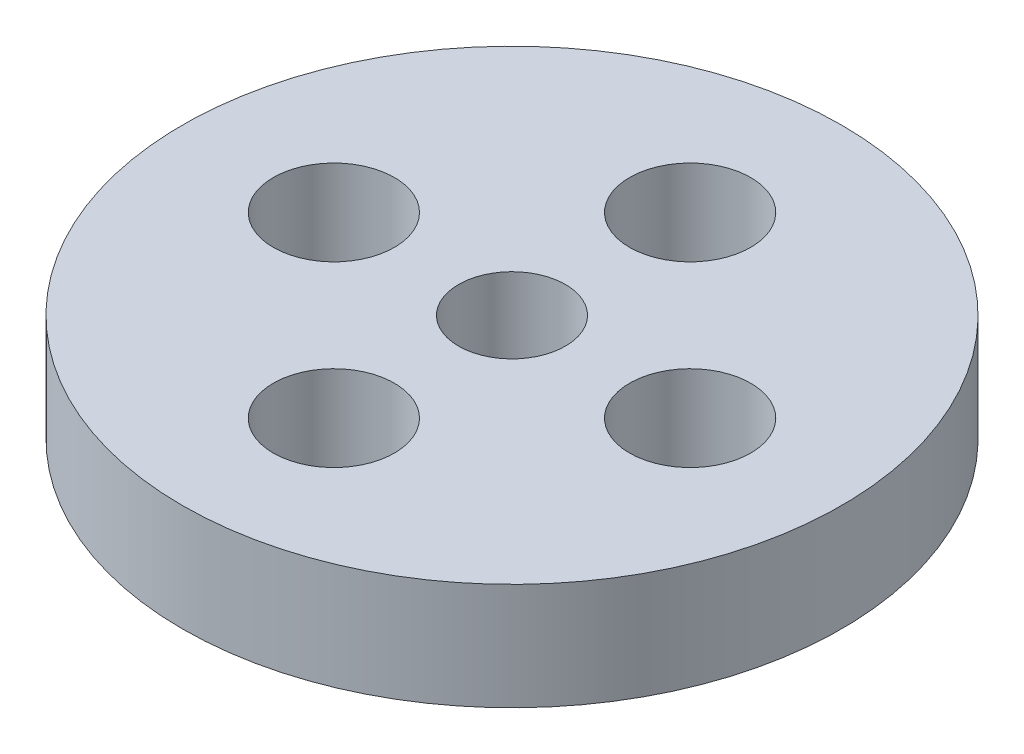
ISO-10303-21;
HEADER;
FILE_DESCRIPTION(('STEP AP214'),'2;1');
FILE_NAME('part.step','',(''),(''),'','','');
FILE_SCHEMA(('AUTOMOTIVE_DESIGN { 1 0 10303 214 1 1 1 1 }'));
ENDSEC;
DATA;
#1=APPLICATION_CONTEXT('core data for automotive mechanical design processes');
#2=APPLICATION_PROTOCOL_DEFINITION('international standard','automotive_design',2000,#1);
#3=PRODUCT_CONTEXT('',#1,'mechanical');
#4=PRODUCT('Part','Part','',(#3));
#5=PRODUCT_RELATED_PRODUCT_CATEGORY('part','',(#4));
#6=PRODUCT_DEFINITION_FORMATION('','',#4);
#7=PRODUCT_DEFINITION_CONTEXT('part definition',#1,'design');
#8=PRODUCT_DEFINITION('design','',#6,#7);
#9=PRODUCT_DEFINITION_SHAPE('','',#8);
#10=(LENGTH_UNIT() NAMED_UNIT(*) SI_UNIT(.MILLI.,.METRE.));
#11=(NAMED_UNIT(*) PLANE_ANGLE_UNIT() SI_UNIT($,.RADIAN.));
#12=(NAMED_UNIT(*) SI_UNIT($,.STERADIAN.) SOLID_ANGLE_UNIT());
#13=UNCERTAINTY_MEASURE_WITH_UNIT(LENGTH_MEASURE(1.E-05),#10,'distance_accuracy_value','');
#14=(GEOMETRIC_REPRESENTATION_CONTEXT(3) GLOBAL_UNCERTAINTY_ASSIGNED_CONTEXT((#13)) GLOBAL_UNIT_ASSIGNED_CONTEXT((#10,
#11,#12)) REPRESENTATION_CONTEXT('',''));
#15=CARTESIAN_POINT('',(0.,0.,0.));
#16=DIRECTION('',(0.,0.,1.));
#17=DIRECTION('',(1.,0.,0.));
#18=AXIS2_PLACEMENT_3D('',#15,#16,#17);
#19=CARTESIAN_POINT('',(0.,3.,0.));
#20=DIRECTION('',(0.,1.,0.));
#21=DIRECTION('',(0.,0.,1.));
#22=AXIS2_PLACEMENT_3D('',#19,#20,#21);
#23=PLANE('',#22);
#24=CARTESIAN_POINT('',(5.,3.,0.));
#25=DIRECTION('',(0.,1.,0.));
#26=DIRECTION('',(0.,0.,1.));
#27=AXIS2_PLACEMENT_3D('',#24,#25,#26);
#28=CIRCLE('',#27,1.7);
#29=CARTESIAN_POINT('',(5.,3.,1.7));
#30=VERTEX_POINT('',#29);
#31=EDGE_CURVE('E78',#30,#30,#28,.T.);
#32=ORIENTED_EDGE('',*,*,#31,.F.);
#33=EDGE_LOOP('',(#32));
#34=FACE_BOUND('',#33,.T.);
#35=CARTESIAN_POINT('',(0.,3.,0.));
#36=DIRECTION('',(0.,1.,0.));
#37=DIRECTION('',(0.,0.,1.));
#38=AXIS2_PLACEMENT_3D('',#35,#36,#37);
#39=CIRCLE('',#38,1.5);
#40=CARTESIAN_POINT('',(0.,3.,1.5));
#41=VERTEX_POINT('',#40);
#42=EDGE_CURVE('E62',#41,#41,#39,.T.);
#43=ORIENTED_EDGE('',*,*,#42,.F.);
#44=EDGE_LOOP('',(#43));
#45=FACE_BOUND('',#44,.T.);
#46=CARTESIAN_POINT('',(0.,3.,0.));
#47=DIRECTION('',(0.,1.,0.));
#48=DIRECTION('',(0.,0.,1.));
#49=AXIS2_PLACEMENT_3D('',#46,#47,#48);
#50=CIRCLE('',#49,9.25);
#51=CARTESIAN_POINT('',(0.,3.,9.25));
#52=VERTEX_POINT('',#51);
#53=EDGE_CURVE('E10',#52,#52,#50,.T.);
#54=ORIENTED_EDGE('',*,*,#53,.T.);
#55=EDGE_LOOP('',(#54));
#56=FACE_BOUND('',#55,.T.);
#57=CARTESIAN_POINT('',(-5.,3.,0.));
#58=DIRECTION('',(0.,1.,0.));
#59=DIRECTION('',(0.,0.,1.));
#60=AXIS2_PLACEMENT_3D('',#57,#58,#59);
#61=CIRCLE('',#60,1.7);
#62=CARTESIAN_POINT('',(-5.,3.,1.7));
#63=VERTEX_POINT('',#62);
#64=EDGE_CURVE('E56',#63,#63,#61,.T.);
#65=ORIENTED_EDGE('',*,*,#64,.F.);
#66=EDGE_LOOP('',(#65));
#67=FACE_BOUND('',#66,.T.);
#68=CARTESIAN_POINT('',(0.,3.,-5.));
#69=DIRECTION('',(0.,1.,0.));
#70=DIRECTION('',(0.,0.,1.));
#71=AXIS2_PLACEMENT_3D('',#68,#69,#70);
#72=CIRCLE('',#71,1.7);
#73=CARTESIAN_POINT('',(0.,3.,-3.3));
#74=VERTEX_POINT('',#73);
#75=EDGE_CURVE('E70',#74,#74,#72,.T.);
#76=ORIENTED_EDGE('',*,*,#75,.F.);
#77=EDGE_LOOP('',(#76));
#78=FACE_BOUND('',#77,.T.);
#79=CARTESIAN_POINT('',(0.,3.,5.));
#80=DIRECTION('',(0.,1.,0.));
#81=DIRECTION('',(0.,0.,1.));
#82=AXIS2_PLACEMENT_3D('',#79,#80,#81);
#83=CIRCLE('',#82,1.7);
#84=CARTESIAN_POINT('',(0.,3.,6.7));
#85=VERTEX_POINT('',#84);
#86=EDGE_CURVE('E86',#85,#85,#83,.T.);
#87=ORIENTED_EDGE('',*,*,#86,.F.);
#88=EDGE_LOOP('',(#87));
#89=FACE_BOUND('',#88,.T.);
#90=ADVANCED_FACE('F43',(#34,#45,#56,#67,#78,#89),#23,.T.);
#91=CARTESIAN_POINT('',(0.,0.,0.));
#92=DIRECTION('',(0.,1.,0.));
#93=DIRECTION('',(0.,0.,1.));
#94=AXIS2_PLACEMENT_3D('',#91,#92,#93);
#95=PLANE('',#94);
#96=CARTESIAN_POINT('',(0.,0.,0.));
#97=DIRECTION('',(0.,1.,0.));
#98=DIRECTION('',(0.,0.,1.));
#99=AXIS2_PLACEMENT_3D('',#96,#97,#98);
#100=CIRCLE('',#99,9.25);
#101=CARTESIAN_POINT('',(0.,0.,9.25));
#102=VERTEX_POINT('',#101);
#103=EDGE_CURVE('E47',#102,#102,#100,.T.);
#104=ORIENTED_EDGE('',*,*,#103,.F.);
#105=EDGE_LOOP('',(#104));
#106=FACE_BOUND('',#105,.T.);
#107=CARTESIAN_POINT('',(-5.,0.,0.));
#108=DIRECTION('',(0.,1.,0.));
#109=DIRECTION('',(0.,0.,1.));
#110=AXIS2_PLACEMENT_3D('',#107,#108,#109);
#111=CIRCLE('',#110,1.7);
#112=CARTESIAN_POINT('',(-5.,0.,1.7));
#113=VERTEX_POINT('',#112);
#114=EDGE_CURVE('E58',#113,#113,#111,.T.);
#115=ORIENTED_EDGE('',*,*,#114,.T.);
#116=EDGE_LOOP('',(#115));
#117=FACE_BOUND('',#116,.T.);
#118=CARTESIAN_POINT('',(0.,0.,0.));
#119=DIRECTION('',(0.,1.,0.));
#120=DIRECTION('',(0.,0.,1.));
#121=AXIS2_PLACEMENT_3D('',#118,#119,#120);
#122=CIRCLE('',#121,1.5);
#123=CARTESIAN_POINT('',(0.,0.,1.5));
#124=VERTEX_POINT('',#123);
#125=EDGE_CURVE('E66',#124,#124,#122,.T.);
#126=ORIENTED_EDGE('',*,*,#125,.T.);
#127=EDGE_LOOP('',(#126));
#128=FACE_BOUND('',#127,.T.);
#129=CARTESIAN_POINT('',(0.,0.,-5.));
#130=DIRECTION('',(0.,1.,0.));
#131=DIRECTION('',(0.,0.,1.));
#132=AXIS2_PLACEMENT_3D('',#129,#130,#131);
#133=CIRCLE('',#132,1.7);
#134=CARTESIAN_POINT('',(0.,0.,-3.3));
#135=VERTEX_POINT('',#134);
#136=EDGE_CURVE('E74',#135,#135,#133,.T.);
#137=ORIENTED_EDGE('',*,*,#136,.T.);
#138=EDGE_LOOP('',(#137));
#139=FACE_BOUND('',#138,.T.);
#140=CARTESIAN_POINT('',(5.,0.,0.));
#141=DIRECTION('',(0.,1.,0.));
#142=DIRECTION('',(0.,0.,1.));
#143=AXIS2_PLACEMENT_3D('',#140,#141,#142);
#144=CIRCLE('',#143,1.7);
#145=CARTESIAN_POINT('',(5.,0.,1.7));
#146=VERTEX_POINT('',#145);
#147=EDGE_CURVE('E82',#146,#146,#144,.T.);
#148=ORIENTED_EDGE('',*,*,#147,.T.);
#149=EDGE_LOOP('',(#148));
#150=FACE_BOUND('',#149,.T.);
#151=CARTESIAN_POINT('',(0.,0.,5.));
#152=DIRECTION('',(0.,1.,0.));
#153=DIRECTION('',(0.,0.,1.));
#154=AXIS2_PLACEMENT_3D('',#151,#152,#153);
#155=CIRCLE('',#154,1.7);
#156=CARTESIAN_POINT('',(0.,0.,6.7));
#157=VERTEX_POINT('',#156);
#158=EDGE_CURVE('E90',#157,#157,#155,.T.);
#159=ORIENTED_EDGE('',*,*,#158,.T.);
#160=EDGE_LOOP('',(#159));
#161=FACE_BOUND('',#160,.T.);
#162=ADVANCED_FACE('F102',(#106,#117,#128,#139,#150,#161),#95,.F.);
#163=CARTESIAN_POINT('',(0.,3.,0.));
#164=DIRECTION('',(0.,-1.,0.));
#165=DIRECTION('',(0.,0.,-1.));
#166=AXIS2_PLACEMENT_3D('',#163,#164,#165);
#167=CYLINDRICAL_SURFACE('',#166,9.25);
#168=ORIENTED_EDGE('',*,*,#53,.F.);
#169=EDGE_LOOP('',(#168));
#170=FACE_BOUND('',#169,.T.);
#171=ORIENTED_EDGE('',*,*,#103,.T.);
#172=EDGE_LOOP('',(#171));
#173=FACE_BOUND('',#172,.T.);
#174=ADVANCED_FACE('F45',(#170,#173),#167,.T.);
#175=CARTESIAN_POINT('',(-5.,3.,0.));
#176=DIRECTION('',(0.,-1.,0.));
#177=DIRECTION('',(0.,0.,-1.));
#178=AXIS2_PLACEMENT_3D('',#175,#176,#177);
#179=CYLINDRICAL_SURFACE('',#178,1.7);
#180=ORIENTED_EDGE('',*,*,#64,.T.);
#181=EDGE_LOOP('',(#180));
#182=FACE_BOUND('',#181,.T.);
#183=ORIENTED_EDGE('',*,*,#114,.F.);
#184=EDGE_LOOP('',(#183));
#185=FACE_BOUND('',#184,.T.);
#186=ADVANCED_FACE('F112',(#182,#185),#179,.F.);
#187=CARTESIAN_POINT('',(0.,3.,0.));
#188=DIRECTION('',(0.,-1.,0.));
#189=DIRECTION('',(0.,0.,-1.));
#190=AXIS2_PLACEMENT_3D('',#187,#188,#189);
#191=CYLINDRICAL_SURFACE('',#190,1.5);
#192=ORIENTED_EDGE('',*,*,#42,.T.);
#193=EDGE_LOOP('',(#192));
#194=FACE_BOUND('',#193,.T.);
#195=ORIENTED_EDGE('',*,*,#125,.F.);
#196=EDGE_LOOP('',(#195));
#197=FACE_BOUND('',#196,.T.);
#198=ADVANCED_FACE('F115',(#194,#197),#191,.F.);
#199=CARTESIAN_POINT('',(0.,3.,-5.));
#200=DIRECTION('',(0.,-1.,0.));
#201=DIRECTION('',(0.,0.,-1.));
#202=AXIS2_PLACEMENT_3D('',#199,#200,#201);
#203=CYLINDRICAL_SURFACE('',#202,1.7);
#204=ORIENTED_EDGE('',*,*,#75,.T.);
#205=EDGE_LOOP('',(#204));
#206=FACE_BOUND('',#205,.T.);
#207=ORIENTED_EDGE('',*,*,#136,.F.);
#208=EDGE_LOOP('',(#207));
#209=FACE_BOUND('',#208,.T.);
#210=ADVANCED_FACE('F119',(#206,#209),#203,.F.);
#211=CARTESIAN_POINT('',(5.,3.,0.));
#212=DIRECTION('',(0.,-1.,0.));
#213=DIRECTION('',(0.,0.,-1.));
#214=AXIS2_PLACEMENT_3D('',#211,#212,#213);
#215=CYLINDRICAL_SURFACE('',#214,1.7);
#216=ORIENTED_EDGE('',*,*,#31,.T.);
#217=EDGE_LOOP('',(#216));
#218=FACE_BOUND('',#217,.T.);
#219=ORIENTED_EDGE('',*,*,#147,.F.);
#220=EDGE_LOOP('',(#219));
#221=FACE_BOUND('',#220,.T.);
#222=ADVANCED_FACE('F123',(#218,#221),#215,.F.);
#223=CARTESIAN_POINT('',(0.,3.,5.));
#224=DIRECTION('',(0.,-1.,0.));
#225=DIRECTION('',(0.,0.,-1.));
#226=AXIS2_PLACEMENT_3D('',#223,#224,#225);
#227=CYLINDRICAL_SURFACE('',#226,1.7);
#228=ORIENTED_EDGE('',*,*,#86,.T.);
#229=EDGE_LOOP('',(#228));
#230=FACE_BOUND('',#229,.T.);
#231=ORIENTED_EDGE('',*,*,#158,.F.);
#232=EDGE_LOOP('',(#231));
#233=FACE_BOUND('',#232,.T.);
#234=ADVANCED_FACE('F98',(#230,#233),#227,.F.);
#235=CLOSED_SHELL('',(#90,#162,#174,#186,#198,#210,#222,#234));
#236=MANIFOLD_SOLID_BREP('B2',#235);
#237=ADVANCED_BREP_SHAPE_REPRESENTATION('',(#18,#236),#14);
#238=SHAPE_DEFINITION_REPRESENTATION(#9,#237);
ENDSEC;
END-ISO-10303-21;
